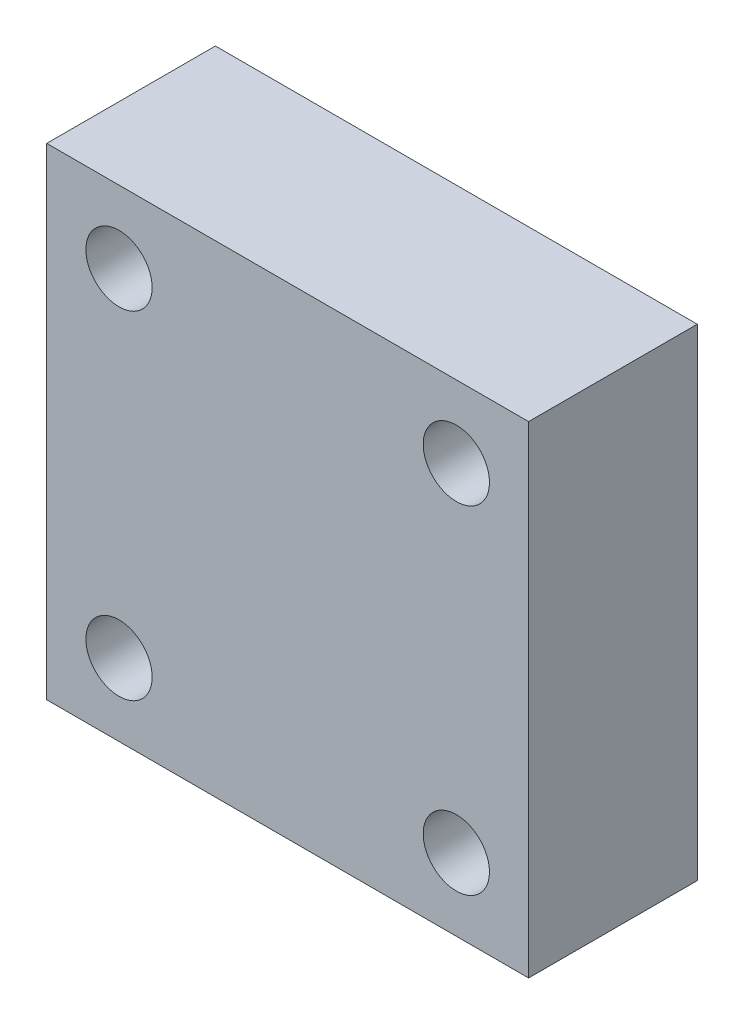
ISO-10303-21;
HEADER;
FILE_DESCRIPTION(('STEP AP214'),'2;1');
FILE_NAME('part.step','',(''),(''),'','','');
FILE_SCHEMA(('AUTOMOTIVE_DESIGN { 1 0 10303 214 1 1 1 1 }'));
ENDSEC;
DATA;
#1=APPLICATION_CONTEXT('core data for automotive mechanical design processes');
#2=APPLICATION_PROTOCOL_DEFINITION('international standard','automotive_design',2000,#1);
#3=PRODUCT_CONTEXT('',#1,'mechanical');
#4=PRODUCT('Part','Part','',(#3));
#5=PRODUCT_RELATED_PRODUCT_CATEGORY('part','',(#4));
#6=PRODUCT_DEFINITION_FORMATION('','',#4);
#7=PRODUCT_DEFINITION_CONTEXT('part definition',#1,'design');
#8=PRODUCT_DEFINITION('design','',#6,#7);
#9=PRODUCT_DEFINITION_SHAPE('','',#8);
#10=(LENGTH_UNIT() NAMED_UNIT(*) SI_UNIT(.MILLI.,.METRE.));
#11=(NAMED_UNIT(*) PLANE_ANGLE_UNIT() SI_UNIT($,.RADIAN.));
#12=(NAMED_UNIT(*) SI_UNIT($,.STERADIAN.) SOLID_ANGLE_UNIT());
#13=UNCERTAINTY_MEASURE_WITH_UNIT(LENGTH_MEASURE(1.E-05),#10,'distance_accuracy_value','');
#14=(GEOMETRIC_REPRESENTATION_CONTEXT(3) GLOBAL_UNCERTAINTY_ASSIGNED_CONTEXT((#13)) GLOBAL_UNIT_ASSIGNED_CONTEXT((#10,
#11,#12)) REPRESENTATION_CONTEXT('',''));
#15=CARTESIAN_POINT('',(0.,0.,0.));
#16=DIRECTION('',(0.,0.,1.));
#17=DIRECTION('',(1.,0.,0.));
#18=AXIS2_PLACEMENT_3D('',#15,#16,#17);
#19=CARTESIAN_POINT('',(14.,14.,-1.));
#20=DIRECTION('',(0.,0.,1.));
#21=DIRECTION('',(1.,0.,0.));
#22=AXIS2_PLACEMENT_3D('',#19,#20,#21);
#23=CYLINDRICAL_SURFACE('',#22,2.75);
#24=CARTESIAN_POINT('',(14.,14.,14.));
#25=DIRECTION('',(0.,0.,1.));
#26=DIRECTION('',(1.,0.,0.));
#27=AXIS2_PLACEMENT_3D('',#24,#25,#26);
#28=CIRCLE('',#27,2.75);
#29=CARTESIAN_POINT('',(16.75,14.,14.));
#30=VERTEX_POINT('',#29);
#31=EDGE_CURVE('E131',#30,#30,#28,.T.);
#32=ORIENTED_EDGE('',*,*,#31,.T.);
#33=EDGE_LOOP('',(#32));
#34=FACE_BOUND('',#33,.T.);
#35=CARTESIAN_POINT('',(14.,14.,0.));
#36=DIRECTION('',(0.,0.,1.));
#37=DIRECTION('',(1.,0.,0.));
#38=AXIS2_PLACEMENT_3D('',#35,#36,#37);
#39=CIRCLE('',#38,2.75);
#40=CARTESIAN_POINT('',(16.75,14.,0.));
#41=VERTEX_POINT('',#40);
#42=EDGE_CURVE('E10',#41,#41,#39,.T.);
#43=ORIENTED_EDGE('',*,*,#42,.F.);
#44=EDGE_LOOP('',(#43));
#45=FACE_BOUND('',#44,.T.);
#46=ADVANCED_FACE('F16',(#34,#45),#23,.F.);
#47=CARTESIAN_POINT('',(-14.,14.,-1.));
#48=DIRECTION('',(0.,0.,1.));
#49=DIRECTION('',(1.,0.,0.));
#50=AXIS2_PLACEMENT_3D('',#47,#48,#49);
#51=CYLINDRICAL_SURFACE('',#50,2.75);
#52=CARTESIAN_POINT('',(-14.,14.,14.));
#53=DIRECTION('',(0.,0.,1.));
#54=DIRECTION('',(1.,0.,0.));
#55=AXIS2_PLACEMENT_3D('',#52,#53,#54);
#56=CIRCLE('',#55,2.75);
#57=CARTESIAN_POINT('',(-11.25,14.,14.));
#58=VERTEX_POINT('',#57);
#59=EDGE_CURVE('E113',#58,#58,#56,.T.);
#60=ORIENTED_EDGE('',*,*,#59,.T.);
#61=EDGE_LOOP('',(#60));
#62=FACE_BOUND('',#61,.T.);
#63=CARTESIAN_POINT('',(-14.,14.,0.));
#64=DIRECTION('',(0.,0.,1.));
#65=DIRECTION('',(1.,0.,0.));
#66=AXIS2_PLACEMENT_3D('',#63,#64,#65);
#67=CIRCLE('',#66,2.75);
#68=CARTESIAN_POINT('',(-11.25,14.,0.));
#69=VERTEX_POINT('',#68);
#70=EDGE_CURVE('E24',#69,#69,#67,.T.);
#71=ORIENTED_EDGE('',*,*,#70,.F.);
#72=EDGE_LOOP('',(#71));
#73=FACE_BOUND('',#72,.T.);
#74=ADVANCED_FACE('F152',(#62,#73),#51,.F.);
#75=CARTESIAN_POINT('',(14.,-14.,-1.));
#76=DIRECTION('',(0.,0.,1.));
#77=DIRECTION('',(1.,0.,0.));
#78=AXIS2_PLACEMENT_3D('',#75,#76,#77);
#79=CYLINDRICAL_SURFACE('',#78,2.75);
#80=CARTESIAN_POINT('',(14.,-14.,14.));
#81=DIRECTION('',(0.,0.,1.));
#82=DIRECTION('',(1.,0.,0.));
#83=AXIS2_PLACEMENT_3D('',#80,#81,#82);
#84=CIRCLE('',#83,2.75);
#85=CARTESIAN_POINT('',(16.75,-14.,14.));
#86=VERTEX_POINT('',#85);
#87=EDGE_CURVE('E109',#86,#86,#84,.T.);
#88=ORIENTED_EDGE('',*,*,#87,.T.);
#89=EDGE_LOOP('',(#88));
#90=FACE_BOUND('',#89,.T.);
#91=CARTESIAN_POINT('',(14.,-14.,0.));
#92=DIRECTION('',(0.,0.,1.));
#93=DIRECTION('',(1.,0.,0.));
#94=AXIS2_PLACEMENT_3D('',#91,#92,#93);
#95=CIRCLE('',#94,2.75);
#96=CARTESIAN_POINT('',(16.75,-14.,0.));
#97=VERTEX_POINT('',#96);
#98=EDGE_CURVE('E141',#97,#97,#95,.T.);
#99=ORIENTED_EDGE('',*,*,#98,.F.);
#100=EDGE_LOOP('',(#99));
#101=FACE_BOUND('',#100,.T.);
#102=ADVANCED_FACE('F154',(#90,#101),#79,.F.);
#103=CARTESIAN_POINT('',(-14.,-14.,-1.));
#104=DIRECTION('',(0.,0.,1.));
#105=DIRECTION('',(1.,0.,0.));
#106=AXIS2_PLACEMENT_3D('',#103,#104,#105);
#107=CYLINDRICAL_SURFACE('',#106,2.75);
#108=CARTESIAN_POINT('',(-14.,-14.,14.));
#109=DIRECTION('',(0.,0.,1.));
#110=DIRECTION('',(1.,0.,0.));
#111=AXIS2_PLACEMENT_3D('',#108,#109,#110);
#112=CIRCLE('',#111,2.75);
#113=CARTESIAN_POINT('',(-11.25,-14.,14.));
#114=VERTEX_POINT('',#113);
#115=EDGE_CURVE('E114',#114,#114,#112,.T.);
#116=ORIENTED_EDGE('',*,*,#115,.T.);
#117=EDGE_LOOP('',(#116));
#118=FACE_BOUND('',#117,.T.);
#119=CARTESIAN_POINT('',(-14.,-14.,0.));
#120=DIRECTION('',(0.,0.,1.));
#121=DIRECTION('',(1.,0.,0.));
#122=AXIS2_PLACEMENT_3D('',#119,#120,#121);
#123=CIRCLE('',#122,2.75);
#124=CARTESIAN_POINT('',(-11.25,-14.,0.));
#125=VERTEX_POINT('',#124);
#126=EDGE_CURVE('E124',#125,#125,#123,.T.);
#127=ORIENTED_EDGE('',*,*,#126,.F.);
#128=EDGE_LOOP('',(#127));
#129=FACE_BOUND('',#128,.T.);
#130=ADVANCED_FACE('F162',(#118,#129),#107,.F.);
#131=CARTESIAN_POINT('',(20.,-20.,0.));
#132=DIRECTION('',(1.,0.,0.));
#133=DIRECTION('',(0.,1.,0.));
#134=AXIS2_PLACEMENT_3D('',#131,#132,#133);
#135=PLANE('',#134);
#136=DIRECTION('',(0.,0.,1.));
#137=VECTOR('',#136,1.);
#138=CARTESIAN_POINT('',(20.,-20.,0.));
#139=LINE('',#138,#137);
#140=CARTESIAN_POINT('',(20.,-20.,0.));
#141=VERTEX_POINT('',#140);
#142=CARTESIAN_POINT('',(20.,-20.,14.));
#143=VERTEX_POINT('',#142);
#144=EDGE_CURVE('E76',#141,#143,#139,.T.);
#145=ORIENTED_EDGE('',*,*,#144,.F.);
#146=DIRECTION('',(0.,1.,0.));
#147=VECTOR('',#146,1.);
#148=CARTESIAN_POINT('',(20.,-20.,0.));
#149=LINE('',#148,#147);
#150=CARTESIAN_POINT('',(20.,20.,0.));
#151=VERTEX_POINT('',#150);
#152=EDGE_CURVE('E36',#141,#151,#149,.T.);
#153=ORIENTED_EDGE('',*,*,#152,.T.);
#154=DIRECTION('',(0.,0.,1.));
#155=VECTOR('',#154,1.);
#156=CARTESIAN_POINT('',(20.,20.,0.));
#157=LINE('',#156,#155);
#158=CARTESIAN_POINT('',(20.,20.,14.));
#159=VERTEX_POINT('',#158);
#160=EDGE_CURVE('E44',#151,#159,#157,.T.);
#161=ORIENTED_EDGE('',*,*,#160,.T.);
#162=DIRECTION('',(0.,1.,0.));
#163=VECTOR('',#162,1.);
#164=CARTESIAN_POINT('',(20.,-20.,14.));
#165=LINE('',#164,#163);
#166=EDGE_CURVE('E117',#143,#159,#165,.T.);
#167=ORIENTED_EDGE('',*,*,#166,.F.);
#168=EDGE_LOOP('',(#145,#153,#161,#167));
#169=FACE_BOUND('',#168,.T.);
#170=ADVANCED_FACE('F173',(#169),#135,.T.);
#171=CARTESIAN_POINT('',(-20.,-20.,0.));
#172=DIRECTION('',(0.,0.,1.));
#173=DIRECTION('',(1.,0.,0.));
#174=AXIS2_PLACEMENT_3D('',#171,#172,#173);
#175=PLANE('',#174);
#176=ORIENTED_EDGE('',*,*,#42,.T.);
#177=EDGE_LOOP('',(#176));
#178=FACE_BOUND('',#177,.T.);
#179=ORIENTED_EDGE('',*,*,#70,.T.);
#180=EDGE_LOOP('',(#179));
#181=FACE_BOUND('',#180,.T.);
#182=ORIENTED_EDGE('',*,*,#98,.T.);
#183=EDGE_LOOP('',(#182));
#184=FACE_BOUND('',#183,.T.);
#185=ORIENTED_EDGE('',*,*,#126,.T.);
#186=EDGE_LOOP('',(#185));
#187=FACE_BOUND('',#186,.T.);
#188=DIRECTION('',(1.,0.,0.));
#189=VECTOR('',#188,1.);
#190=CARTESIAN_POINT('',(-20.,20.,0.));
#191=LINE('',#190,#189);
#192=CARTESIAN_POINT('',(-20.,20.,0.));
#193=VERTEX_POINT('',#192);
#194=EDGE_CURVE('E106',#193,#151,#191,.T.);
#195=ORIENTED_EDGE('',*,*,#194,.T.);
#196=ORIENTED_EDGE('',*,*,#152,.F.);
#197=DIRECTION('',(1.,0.,0.));
#198=VECTOR('',#197,1.);
#199=CARTESIAN_POINT('',(-20.,-20.,0.));
#200=LINE('',#199,#198);
#201=CARTESIAN_POINT('',(-20.,-20.,0.));
#202=VERTEX_POINT('',#201);
#203=EDGE_CURVE('E81',#202,#141,#200,.T.);
#204=ORIENTED_EDGE('',*,*,#203,.F.);
#205=DIRECTION('',(0.,1.,0.));
#206=VECTOR('',#205,1.);
#207=CARTESIAN_POINT('',(-20.,-20.,0.));
#208=LINE('',#207,#206);
#209=EDGE_CURVE('E89',#202,#193,#208,.T.);
#210=ORIENTED_EDGE('',*,*,#209,.T.);
#211=EDGE_LOOP('',(#195,#196,#204,#210));
#212=FACE_BOUND('',#211,.T.);
#213=ADVANCED_FACE('F149',(#178,#181,#184,#187,#212),#175,.F.);
#214=CARTESIAN_POINT('',(-20.,20.,0.));
#215=DIRECTION('',(0.,1.,0.));
#216=DIRECTION('',(1.,0.,0.));
#217=AXIS2_PLACEMENT_3D('',#214,#215,#216);
#218=PLANE('',#217);
#219=ORIENTED_EDGE('',*,*,#194,.F.);
#220=DIRECTION('',(0.,0.,1.));
#221=VECTOR('',#220,1.);
#222=CARTESIAN_POINT('',(-20.,20.,0.));
#223=LINE('',#222,#221);
#224=CARTESIAN_POINT('',(-20.,20.,14.));
#225=VERTEX_POINT('',#224);
#226=EDGE_CURVE('E96',#193,#225,#223,.T.);
#227=ORIENTED_EDGE('',*,*,#226,.T.);
#228=DIRECTION('',(1.,0.,0.));
#229=VECTOR('',#228,1.);
#230=CARTESIAN_POINT('',(-20.,20.,14.));
#231=LINE('',#230,#229);
#232=EDGE_CURVE('E93',#225,#159,#231,.T.);
#233=ORIENTED_EDGE('',*,*,#232,.T.);
#234=ORIENTED_EDGE('',*,*,#160,.F.);
#235=EDGE_LOOP('',(#219,#227,#233,#234));
#236=FACE_BOUND('',#235,.T.);
#237=ADVANCED_FACE('F168',(#236),#218,.T.);
#238=CARTESIAN_POINT('',(-20.,-20.,14.));
#239=DIRECTION('',(0.,0.,1.));
#240=DIRECTION('',(1.,0.,0.));
#241=AXIS2_PLACEMENT_3D('',#238,#239,#240);
#242=PLANE('',#241);
#243=ORIENTED_EDGE('',*,*,#31,.F.);
#244=EDGE_LOOP('',(#243));
#245=FACE_BOUND('',#244,.T.);
#246=ORIENTED_EDGE('',*,*,#59,.F.);
#247=EDGE_LOOP('',(#246));
#248=FACE_BOUND('',#247,.T.);
#249=ORIENTED_EDGE('',*,*,#87,.F.);
#250=EDGE_LOOP('',(#249));
#251=FACE_BOUND('',#250,.T.);
#252=ORIENTED_EDGE('',*,*,#115,.F.);
#253=EDGE_LOOP('',(#252));
#254=FACE_BOUND('',#253,.T.);
#255=DIRECTION('',(0.,1.,0.));
#256=VECTOR('',#255,1.);
#257=CARTESIAN_POINT('',(-20.,-20.,14.));
#258=LINE('',#257,#256);
#259=CARTESIAN_POINT('',(-20.,-20.,14.));
#260=VERTEX_POINT('',#259);
#261=EDGE_CURVE('E87',#260,#225,#258,.T.);
#262=ORIENTED_EDGE('',*,*,#261,.F.);
#263=DIRECTION('',(1.,0.,0.));
#264=VECTOR('',#263,1.);
#265=CARTESIAN_POINT('',(-20.,-20.,14.));
#266=LINE('',#265,#264);
#267=EDGE_CURVE('E70',#260,#143,#266,.T.);
#268=ORIENTED_EDGE('',*,*,#267,.T.);
#269=ORIENTED_EDGE('',*,*,#166,.T.);
#270=ORIENTED_EDGE('',*,*,#232,.F.);
#271=EDGE_LOOP('',(#262,#268,#269,#270));
#272=FACE_BOUND('',#271,.T.);
#273=ADVANCED_FACE('F92',(#245,#248,#251,#254,#272),#242,.T.);
#274=CARTESIAN_POINT('',(-20.,-20.,0.));
#275=DIRECTION('',(0.,1.,0.));
#276=DIRECTION('',(1.,0.,0.));
#277=AXIS2_PLACEMENT_3D('',#274,#275,#276);
#278=PLANE('',#277);
#279=ORIENTED_EDGE('',*,*,#144,.T.);
#280=ORIENTED_EDGE('',*,*,#267,.F.);
#281=DIRECTION('',(0.,0.,1.));
#282=VECTOR('',#281,1.);
#283=CARTESIAN_POINT('',(-20.,-20.,0.));
#284=LINE('',#283,#282);
#285=EDGE_CURVE('E74',#202,#260,#284,.T.);
#286=ORIENTED_EDGE('',*,*,#285,.F.);
#287=ORIENTED_EDGE('',*,*,#203,.T.);
#288=EDGE_LOOP('',(#279,#280,#286,#287));
#289=FACE_BOUND('',#288,.T.);
#290=ADVANCED_FACE('F72',(#289),#278,.F.);
#291=CARTESIAN_POINT('',(-20.,-20.,0.));
#292=DIRECTION('',(1.,0.,0.));
#293=DIRECTION('',(0.,1.,0.));
#294=AXIS2_PLACEMENT_3D('',#291,#292,#293);
#295=PLANE('',#294);
#296=ORIENTED_EDGE('',*,*,#261,.T.);
#297=ORIENTED_EDGE('',*,*,#226,.F.);
#298=ORIENTED_EDGE('',*,*,#209,.F.);
#299=ORIENTED_EDGE('',*,*,#285,.T.);
#300=EDGE_LOOP('',(#296,#297,#298,#299));
#301=FACE_BOUND('',#300,.T.);
#302=ADVANCED_FACE('F85',(#301),#295,.F.);
#303=CLOSED_SHELL('',(#46,#74,#102,#130,#170,#213,#237,#273,#290,#302));
#304=MANIFOLD_SOLID_BREP('B1',#303);
#305=ADVANCED_BREP_SHAPE_REPRESENTATION('',(#18,#304),#14);
#306=SHAPE_DEFINITION_REPRESENTATION(#9,#305);
ENDSEC;
END-ISO-10303-21;
